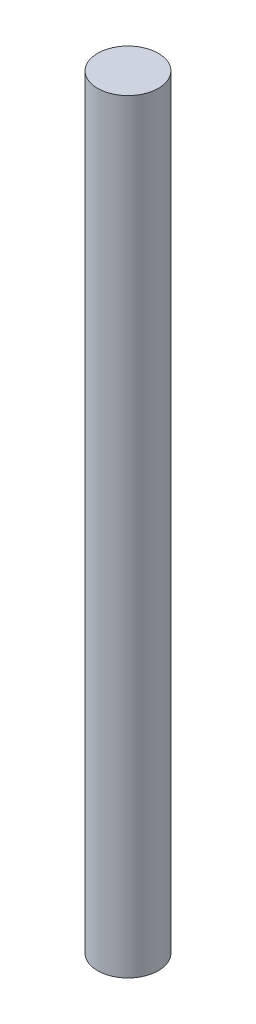
ISO-10303-21;
HEADER;
FILE_DESCRIPTION(('STEP AP214'),'2;1');
FILE_NAME('part.step','',(''),(''),'','','');
FILE_SCHEMA(('AUTOMOTIVE_DESIGN { 1 0 10303 214 1 1 1 1 }'));
ENDSEC;
DATA;
#1=APPLICATION_CONTEXT('core data for automotive mechanical design processes');
#2=APPLICATION_PROTOCOL_DEFINITION('international standard','automotive_design',2000,#1);
#3=PRODUCT_CONTEXT('',#1,'mechanical');
#4=PRODUCT('Part','Part','',(#3));
#5=PRODUCT_RELATED_PRODUCT_CATEGORY('part','',(#4));
#6=PRODUCT_DEFINITION_FORMATION('','',#4);
#7=PRODUCT_DEFINITION_CONTEXT('part definition',#1,'design');
#8=PRODUCT_DEFINITION('design','',#6,#7);
#9=PRODUCT_DEFINITION_SHAPE('','',#8);
#10=(LENGTH_UNIT() NAMED_UNIT(*) SI_UNIT(.MILLI.,.METRE.));
#11=(NAMED_UNIT(*) PLANE_ANGLE_UNIT() SI_UNIT($,.RADIAN.));
#12=(NAMED_UNIT(*) SI_UNIT($,.STERADIAN.) SOLID_ANGLE_UNIT());
#13=UNCERTAINTY_MEASURE_WITH_UNIT(LENGTH_MEASURE(1.E-05),#10,'distance_accuracy_value','');
#14=(GEOMETRIC_REPRESENTATION_CONTEXT(3) GLOBAL_UNCERTAINTY_ASSIGNED_CONTEXT((#13)) GLOBAL_UNIT_ASSIGNED_CONTEXT((#10,
#11,#12)) REPRESENTATION_CONTEXT('',''));
#15=CARTESIAN_POINT('',(0.,0.,0.));
#16=DIRECTION('',(0.,0.,1.));
#17=DIRECTION('',(1.,0.,0.));
#18=AXIS2_PLACEMENT_3D('',#15,#16,#17);
#19=CARTESIAN_POINT('',(0.,60.,0.));
#20=DIRECTION('',(0.,-1.,0.));
#21=DIRECTION('',(0.,0.,-1.));
#22=AXIS2_PLACEMENT_3D('',#19,#20,#21);
#23=CYLINDRICAL_SURFACE('',#22,2.385);
#24=CARTESIAN_POINT('',(0.,60.,0.));
#25=DIRECTION('',(0.,1.,0.));
#26=DIRECTION('',(0.,0.,1.));
#27=AXIS2_PLACEMENT_3D('',#24,#25,#26);
#28=CIRCLE('',#27,2.385);
#29=CARTESIAN_POINT('',(0.,60.,2.385));
#30=VERTEX_POINT('',#29);
#31=EDGE_CURVE('E10',#30,#30,#28,.T.);
#32=ORIENTED_EDGE('',*,*,#31,.F.);
#33=EDGE_LOOP('',(#32));
#34=FACE_BOUND('',#33,.T.);
#35=CARTESIAN_POINT('',(0.,0.,0.));
#36=DIRECTION('',(0.,1.,0.));
#37=DIRECTION('',(0.,0.,1.));
#38=AXIS2_PLACEMENT_3D('',#35,#36,#37);
#39=CIRCLE('',#38,2.385);
#40=CARTESIAN_POINT('',(0.,0.,2.385));
#41=VERTEX_POINT('',#40);
#42=EDGE_CURVE('E33',#41,#41,#39,.T.);
#43=ORIENTED_EDGE('',*,*,#42,.T.);
#44=EDGE_LOOP('',(#43));
#45=FACE_BOUND('',#44,.T.);
#46=ADVANCED_FACE('F30',(#34,#45),#23,.T.);
#47=CARTESIAN_POINT('',(0.,60.,0.));
#48=DIRECTION('',(0.,1.,0.));
#49=DIRECTION('',(0.,0.,1.));
#50=AXIS2_PLACEMENT_3D('',#47,#48,#49);
#51=PLANE('',#50);
#52=ORIENTED_EDGE('',*,*,#31,.T.);
#53=EDGE_LOOP('',(#52));
#54=FACE_BOUND('',#53,.T.);
#55=ADVANCED_FACE('F45',(#54),#51,.T.);
#56=CARTESIAN_POINT('',(0.,0.,0.));
#57=DIRECTION('',(0.,1.,0.));
#58=DIRECTION('',(0.,0.,1.));
#59=AXIS2_PLACEMENT_3D('',#56,#57,#58);
#60=PLANE('',#59);
#61=ORIENTED_EDGE('',*,*,#42,.F.);
#62=EDGE_LOOP('',(#61));
#63=FACE_BOUND('',#62,.T.);
#64=ADVANCED_FACE('F43',(#63),#60,.F.);
#65=CLOSED_SHELL('',(#46,#55,#64));
#66=MANIFOLD_SOLID_BREP('B2',#65);
#67=ADVANCED_BREP_SHAPE_REPRESENTATION('',(#18,#66),#14);
#68=SHAPE_DEFINITION_REPRESENTATION(#9,#67);
ENDSEC;
END-ISO-10303-21;
